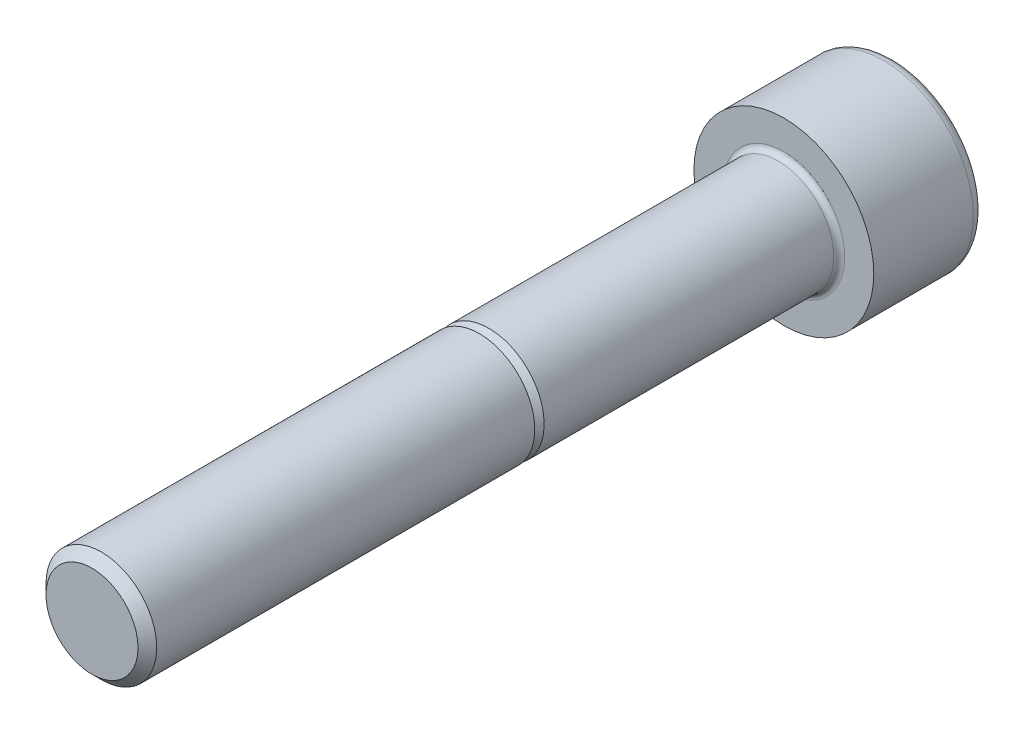
ISO-10303-21;
HEADER;
FILE_DESCRIPTION(('STEP AP214'),'2;1');
FILE_NAME('part.step','',(''),(''),'','','');
FILE_SCHEMA(('AUTOMOTIVE_DESIGN { 1 0 10303 214 1 1 1 1 }'));
ENDSEC;
DATA;
#1=APPLICATION_CONTEXT('core data for automotive mechanical design processes');
#2=APPLICATION_PROTOCOL_DEFINITION('international standard','automotive_design',2000,#1);
#3=PRODUCT_CONTEXT('',#1,'mechanical');
#4=PRODUCT('Part','Part','',(#3));
#5=PRODUCT_RELATED_PRODUCT_CATEGORY('part','',(#4));
#6=PRODUCT_DEFINITION_FORMATION('','',#4);
#7=PRODUCT_DEFINITION_CONTEXT('part definition',#1,'design');
#8=PRODUCT_DEFINITION('design','',#6,#7);
#9=PRODUCT_DEFINITION_SHAPE('','',#8);
#10=(LENGTH_UNIT() NAMED_UNIT(*) SI_UNIT(.MILLI.,.METRE.));
#11=(NAMED_UNIT(*) PLANE_ANGLE_UNIT() SI_UNIT($,.RADIAN.));
#12=(NAMED_UNIT(*) SI_UNIT($,.STERADIAN.) SOLID_ANGLE_UNIT());
#13=UNCERTAINTY_MEASURE_WITH_UNIT(LENGTH_MEASURE(1.E-05),#10,'distance_accuracy_value','');
#14=(GEOMETRIC_REPRESENTATION_CONTEXT(3) GLOBAL_UNCERTAINTY_ASSIGNED_CONTEXT((#13)) GLOBAL_UNIT_ASSIGNED_CONTEXT((#10,
#11,#12)) REPRESENTATION_CONTEXT('',''));
#15=CARTESIAN_POINT('',(0.,0.,0.));
#16=DIRECTION('',(0.,0.,1.));
#17=DIRECTION('',(1.,0.,0.));
#18=AXIS2_PLACEMENT_3D('',#15,#16,#17);
#19=CARTESIAN_POINT('',(0.,0.,-4.));
#20=DIRECTION('',(0.,0.,-1.));
#21=DIRECTION('',(-1.,0.,0.));
#22=AXIS2_PLACEMENT_3D('',#19,#20,#21);
#23=PLANE('',#22);
#24=DIRECTION('',(0.,-1.,0.));
#25=VECTOR('',#24,1.);
#26=CARTESIAN_POINT('',(3.,1.73205080756887,-4.));
#27=LINE('',#26,#25);
#28=CARTESIAN_POINT('',(3.,1.73205080756887,-4.));
#29=VERTEX_POINT('',#28);
#30=CARTESIAN_POINT('',(3.,0.,-4.));
#31=VERTEX_POINT('',#30);
#32=EDGE_CURVE('E298',#29,#31,#27,.T.);
#33=ORIENTED_EDGE('',*,*,#32,.T.);
#34=CARTESIAN_POINT('',(0.,0.,-4.));
#35=DIRECTION('',(0.,0.,1.));
#36=DIRECTION('',(1.,0.,0.));
#37=AXIS2_PLACEMENT_3D('',#34,#35,#36);
#38=CIRCLE('',#37,3.);
#39=CARTESIAN_POINT('',(1.5,2.59807621135332,-4.));
#40=VERTEX_POINT('',#39);
#41=EDGE_CURVE('E60',#31,#40,#38,.T.);
#42=ORIENTED_EDGE('',*,*,#41,.T.);
#43=DIRECTION('',(0.866025403784438,-0.500000000000001,0.));
#44=VECTOR('',#43,1.);
#45=CARTESIAN_POINT('',(0.,3.46410161513775,-4.));
#46=LINE('',#45,#44);
#47=EDGE_CURVE('E295',#40,#29,#46,.T.);
#48=ORIENTED_EDGE('',*,*,#47,.T.);
#49=EDGE_LOOP('',(#33,#42,#48));
#50=FACE_BOUND('',#49,.T.);
#51=ADVANCED_FACE('F45',(#50),#23,.T.);
#52=CARTESIAN_POINT('',(0.,3.46410161513775,-4.));
#53=VERTEX_POINT('',#52);
#54=EDGE_CURVE('E296',#53,#40,#46,.T.);
#55=ORIENTED_EDGE('',*,*,#54,.T.);
#56=CARTESIAN_POINT('',(-1.5,2.59807621135332,-4.));
#57=VERTEX_POINT('',#56);
#58=EDGE_CURVE('E236',#40,#57,#38,.T.);
#59=ORIENTED_EDGE('',*,*,#58,.T.);
#60=DIRECTION('',(0.866025403784439,0.499999999999999,0.));
#61=VECTOR('',#60,1.);
#62=CARTESIAN_POINT('',(-3.,1.73205080756888,-4.));
#63=LINE('',#62,#61);
#64=EDGE_CURVE('E291',#57,#53,#63,.T.);
#65=ORIENTED_EDGE('',*,*,#64,.T.);
#66=EDGE_LOOP('',(#55,#59,#65));
#67=FACE_BOUND('',#66,.T.);
#68=ADVANCED_FACE('F136',(#67),#23,.T.);
#69=CARTESIAN_POINT('',(-3.,1.73205080756888,-4.));
#70=VERTEX_POINT('',#69);
#71=EDGE_CURVE('E292',#70,#57,#63,.T.);
#72=ORIENTED_EDGE('',*,*,#71,.T.);
#73=CARTESIAN_POINT('',(-3.,0.,-4.));
#74=VERTEX_POINT('',#73);
#75=EDGE_CURVE('E278',#57,#74,#38,.T.);
#76=ORIENTED_EDGE('',*,*,#75,.T.);
#77=DIRECTION('',(0.,1.,0.));
#78=VECTOR('',#77,1.);
#79=CARTESIAN_POINT('',(-3.,-1.73205080756887,-4.));
#80=LINE('',#79,#78);
#81=EDGE_CURVE('E287',#74,#70,#80,.T.);
#82=ORIENTED_EDGE('',*,*,#81,.T.);
#83=EDGE_LOOP('',(#72,#76,#82));
#84=FACE_BOUND('',#83,.T.);
#85=ADVANCED_FACE('F142',(#84),#23,.T.);
#86=CARTESIAN_POINT('',(-3.,-1.73205080756887,-4.));
#87=VERTEX_POINT('',#86);
#88=EDGE_CURVE('E288',#87,#74,#80,.T.);
#89=ORIENTED_EDGE('',*,*,#88,.T.);
#90=CARTESIAN_POINT('',(-1.5,-2.59807621135332,-4.));
#91=VERTEX_POINT('',#90);
#92=EDGE_CURVE('E282',#74,#91,#38,.T.);
#93=ORIENTED_EDGE('',*,*,#92,.T.);
#94=DIRECTION('',(-0.866025403784438,0.500000000000001,0.));
#95=VECTOR('',#94,1.);
#96=CARTESIAN_POINT('',(0.,-3.46410161513775,-4.));
#97=LINE('',#96,#95);
#98=EDGE_CURVE('E251',#91,#87,#97,.T.);
#99=ORIENTED_EDGE('',*,*,#98,.T.);
#100=EDGE_LOOP('',(#89,#93,#99));
#101=FACE_BOUND('',#100,.T.);
#102=ADVANCED_FACE('F314',(#101),#23,.T.);
#103=CARTESIAN_POINT('',(0.,-3.46410161513775,-4.));
#104=VERTEX_POINT('',#103);
#105=EDGE_CURVE('E284',#104,#91,#97,.T.);
#106=ORIENTED_EDGE('',*,*,#105,.T.);
#107=CARTESIAN_POINT('',(1.5,-2.59807621135332,-4.));
#108=VERTEX_POINT('',#107);
#109=EDGE_CURVE('E310',#91,#108,#38,.T.);
#110=ORIENTED_EDGE('',*,*,#109,.T.);
#111=DIRECTION('',(-0.866025403784439,-0.499999999999999,0.));
#112=VECTOR('',#111,1.);
#113=CARTESIAN_POINT('',(3.,-1.73205080756888,-4.));
#114=LINE('',#113,#112);
#115=EDGE_CURVE('E299',#108,#104,#114,.T.);
#116=ORIENTED_EDGE('',*,*,#115,.T.);
#117=EDGE_LOOP('',(#106,#110,#116));
#118=FACE_BOUND('',#117,.T.);
#119=ADVANCED_FACE('F134',(#118),#23,.T.);
#120=CARTESIAN_POINT('',(0.,0.,50.));
#121=DIRECTION('',(0.,0.,-1.));
#122=DIRECTION('',(-1.,0.,0.));
#123=AXIS2_PLACEMENT_3D('',#120,#121,#122);
#124=CYLINDRICAL_SURFACE('',#123,4.);
#125=CARTESIAN_POINT('',(0.,0.,49.3234375));
#126=DIRECTION('',(0.,0.,1.));
#127=DIRECTION('',(1.,0.,0.));
#128=AXIS2_PLACEMENT_3D('',#125,#126,#127);
#129=CIRCLE('',#128,4.);
#130=CARTESIAN_POINT('',(-3.99999999999999,0.,49.3234375));
#131=VERTEX_POINT('',#130);
#132=EDGE_CURVE('E217',#131,#131,#129,.F.);
#133=ORIENTED_EDGE('',*,*,#132,.T.);
#134=EDGE_LOOP('',(#133));
#135=FACE_BOUND('',#134,.T.);
#136=CARTESIAN_POINT('',(0.,0.,22.));
#137=DIRECTION('',(0.,0.,-1.));
#138=DIRECTION('',(-1.,0.,0.));
#139=AXIS2_PLACEMENT_3D('',#136,#137,#138);
#140=CIRCLE('',#139,4.);
#141=CARTESIAN_POINT('',(-4.,0.,22.));
#142=VERTEX_POINT('',#141);
#143=EDGE_CURVE('E254',#142,#142,#140,.T.);
#144=ORIENTED_EDGE('',*,*,#143,.F.);
#145=EDGE_LOOP('',(#144));
#146=FACE_BOUND('',#145,.T.);
#147=ADVANCED_FACE('F194',(#135,#146),#124,.T.);
#148=CARTESIAN_POINT('',(4.,0.,50.));
#149=DIRECTION('',(0.,0.,1.));
#150=DIRECTION('',(1.,0.,0.));
#151=AXIS2_PLACEMENT_3D('',#148,#149,#150);
#152=PLANE('',#151);
#153=CARTESIAN_POINT('',(0.,0.,50.));
#154=DIRECTION('',(0.,0.,1.));
#155=DIRECTION('',(1.,0.,0.));
#156=AXIS2_PLACEMENT_3D('',#153,#154,#155);
#157=CIRCLE('',#156,3.3234375);
#158=CARTESIAN_POINT('',(-3.32343749999999,0.,50.));
#159=VERTEX_POINT('',#158);
#160=EDGE_CURVE('E213',#159,#159,#157,.T.);
#161=ORIENTED_EDGE('',*,*,#160,.T.);
#162=EDGE_LOOP('',(#161));
#163=FACE_BOUND('',#162,.T.);
#164=ADVANCED_FACE('F190',(#163),#152,.T.);
#165=CARTESIAN_POINT('',(0.,0.,-8.));
#166=DIRECTION('',(0.,0.,-1.));
#167=DIRECTION('',(-1.,0.,0.));
#168=AXIS2_PLACEMENT_3D('',#165,#166,#167);
#169=PLANE('',#168);
#170=CARTESIAN_POINT('',(0.,0.,-8.));
#171=DIRECTION('',(0.,0.,-1.));
#172=DIRECTION('',(-1.,0.,0.));
#173=AXIS2_PLACEMENT_3D('',#170,#171,#172);
#174=CIRCLE('',#173,5.7);
#175=CARTESIAN_POINT('',(-5.7,0.,-8.));
#176=VERTEX_POINT('',#175);
#177=EDGE_CURVE('E53',#176,#176,#174,.T.);
#178=ORIENTED_EDGE('',*,*,#177,.T.);
#179=EDGE_LOOP('',(#178));
#180=FACE_BOUND('',#179,.T.);
#181=DIRECTION('',(-0.866025403784438,0.500000000000001,0.));
#182=VECTOR('',#181,1.);
#183=CARTESIAN_POINT('',(0.,-3.46410161513775,-8.));
#184=LINE('',#183,#182);
#185=CARTESIAN_POINT('',(0.,-3.46410161513775,-8.));
#186=VERTEX_POINT('',#185);
#187=CARTESIAN_POINT('',(-3.,-1.73205080756887,-8.));
#188=VERTEX_POINT('',#187);
#189=EDGE_CURVE('E68',#186,#188,#184,.T.);
#190=ORIENTED_EDGE('',*,*,#189,.F.);
#191=DIRECTION('',(-0.866025403784439,-0.499999999999999,0.));
#192=VECTOR('',#191,1.);
#193=CARTESIAN_POINT('',(3.,-1.73205080756888,-8.));
#194=LINE('',#193,#192);
#195=CARTESIAN_POINT('',(3.,-1.73205080756888,-8.));
#196=VERTEX_POINT('',#195);
#197=EDGE_CURVE('E228',#196,#186,#194,.T.);
#198=ORIENTED_EDGE('',*,*,#197,.F.);
#199=DIRECTION('',(0.,-1.,0.));
#200=VECTOR('',#199,1.);
#201=CARTESIAN_POINT('',(3.,1.73205080756887,-8.));
#202=LINE('',#201,#200);
#203=CARTESIAN_POINT('',(3.,1.73205080756887,-8.));
#204=VERTEX_POINT('',#203);
#205=EDGE_CURVE('E247',#204,#196,#202,.T.);
#206=ORIENTED_EDGE('',*,*,#205,.F.);
#207=DIRECTION('',(0.866025403784438,-0.500000000000001,0.));
#208=VECTOR('',#207,1.);
#209=CARTESIAN_POINT('',(0.,3.46410161513775,-8.));
#210=LINE('',#209,#208);
#211=CARTESIAN_POINT('',(0.,3.46410161513775,-8.));
#212=VERTEX_POINT('',#211);
#213=EDGE_CURVE('E244',#212,#204,#210,.T.);
#214=ORIENTED_EDGE('',*,*,#213,.F.);
#215=DIRECTION('',(0.866025403784439,0.499999999999999,0.));
#216=VECTOR('',#215,1.);
#217=CARTESIAN_POINT('',(-3.,1.73205080756888,-8.));
#218=LINE('',#217,#216);
#219=CARTESIAN_POINT('',(-3.,1.73205080756888,-8.));
#220=VERTEX_POINT('',#219);
#221=EDGE_CURVE('E233',#220,#212,#218,.T.);
#222=ORIENTED_EDGE('',*,*,#221,.F.);
#223=DIRECTION('',(0.,1.,0.));
#224=VECTOR('',#223,1.);
#225=CARTESIAN_POINT('',(-3.,-1.73205080756887,-8.));
#226=LINE('',#225,#224);
#227=EDGE_CURVE('E231',#188,#220,#226,.T.);
#228=ORIENTED_EDGE('',*,*,#227,.F.);
#229=EDGE_LOOP('',(#190,#198,#206,#214,#222,#228));
#230=FACE_BOUND('',#229,.T.);
#231=ADVANCED_FACE('F186',(#180,#230),#169,.T.);
#232=CARTESIAN_POINT('',(0.,0.,50.));
#233=DIRECTION('',(0.,0.,-1.));
#234=DIRECTION('',(-1.,0.,0.));
#235=AXIS2_PLACEMENT_3D('',#232,#233,#234);
#236=CYLINDRICAL_SURFACE('',#235,6.5);
#237=CARTESIAN_POINT('',(0.,0.,-7.2));
#238=DIRECTION('',(0.,0.,-1.));
#239=DIRECTION('',(-1.,0.,0.));
#240=AXIS2_PLACEMENT_3D('',#237,#238,#239);
#241=CIRCLE('',#240,6.5);
#242=CARTESIAN_POINT('',(-6.5,0.,-7.2));
#243=VERTEX_POINT('',#242);
#244=EDGE_CURVE('E11',#243,#243,#241,.F.);
#245=ORIENTED_EDGE('',*,*,#244,.T.);
#246=EDGE_LOOP('',(#245));
#247=FACE_BOUND('',#246,.T.);
#248=CARTESIAN_POINT('',(0.,0.,0.));
#249=DIRECTION('',(0.,0.,-1.));
#250=DIRECTION('',(-1.,0.,0.));
#251=AXIS2_PLACEMENT_3D('',#248,#249,#250);
#252=CIRCLE('',#251,6.5);
#253=CARTESIAN_POINT('',(-6.5,0.,0.));
#254=VERTEX_POINT('',#253);
#255=EDGE_CURVE('E273',#254,#254,#252,.T.);
#256=ORIENTED_EDGE('',*,*,#255,.T.);
#257=EDGE_LOOP('',(#256));
#258=FACE_BOUND('',#257,.T.);
#259=ADVANCED_FACE('F182',(#247,#258),#236,.T.);
#260=CARTESIAN_POINT('',(6.5,0.,0.));
#261=DIRECTION('',(0.,0.,1.));
#262=DIRECTION('',(1.,0.,0.));
#263=AXIS2_PLACEMENT_3D('',#260,#261,#262);
#264=PLANE('',#263);
#265=CARTESIAN_POINT('',(0.,0.,0.));
#266=DIRECTION('',(0.,0.,1.));
#267=DIRECTION('',(1.,0.,0.));
#268=AXIS2_PLACEMENT_3D('',#265,#266,#267);
#269=CIRCLE('',#268,4.4);
#270=CARTESIAN_POINT('',(4.4,0.,0.));
#271=VERTEX_POINT('',#270);
#272=EDGE_CURVE('E212',#271,#271,#269,.F.);
#273=ORIENTED_EDGE('',*,*,#272,.T.);
#274=EDGE_LOOP('',(#273));
#275=FACE_BOUND('',#274,.T.);
#276=ORIENTED_EDGE('',*,*,#255,.F.);
#277=EDGE_LOOP('',(#276));
#278=FACE_BOUND('',#277,.T.);
#279=ADVANCED_FACE('F178',(#275,#278),#264,.T.);
#280=CARTESIAN_POINT('',(0.,0.,50.));
#281=DIRECTION('',(0.,0.,-1.));
#282=DIRECTION('',(-1.,0.,0.));
#283=AXIS2_PLACEMENT_3D('',#280,#281,#282);
#284=CYLINDRICAL_SURFACE('',#283,4.);
#285=CARTESIAN_POINT('',(0.,0.,0.399999999999998));
#286=DIRECTION('',(0.,0.,1.));
#287=DIRECTION('',(1.,0.,0.));
#288=AXIS2_PLACEMENT_3D('',#285,#286,#287);
#289=CIRCLE('',#288,4.);
#290=CARTESIAN_POINT('',(4.,0.,0.399999999999997));
#291=VERTEX_POINT('',#290);
#292=EDGE_CURVE('E209',#291,#291,#289,.T.);
#293=ORIENTED_EDGE('',*,*,#292,.T.);
#294=EDGE_LOOP('',(#293));
#295=FACE_BOUND('',#294,.T.);
#296=CARTESIAN_POINT('',(0.,0.,21.3234375));
#297=DIRECTION('',(0.,0.,-1.));
#298=DIRECTION('',(-1.,0.,0.));
#299=AXIS2_PLACEMENT_3D('',#296,#297,#298);
#300=CIRCLE('',#299,4.);
#301=CARTESIAN_POINT('',(-4.,0.,21.3234375));
#302=VERTEX_POINT('',#301);
#303=EDGE_CURVE('E270',#302,#302,#300,.T.);
#304=ORIENTED_EDGE('',*,*,#303,.T.);
#305=EDGE_LOOP('',(#304));
#306=FACE_BOUND('',#305,.T.);
#307=ADVANCED_FACE('F174',(#295,#306),#284,.T.);
#308=CARTESIAN_POINT('',(0.,0.,21.3234375));
#309=DIRECTION('',(0.,0.,-1.));
#310=DIRECTION('',(-1.,0.,0.));
#311=AXIS2_PLACEMENT_3D('',#308,#309,#310);
#312=CONICAL_SURFACE('',#311,4.,0.785398163397451);
#313=CARTESIAN_POINT('',(0.,0.,22.));
#314=DIRECTION('',(0.,0.,-1.));
#315=DIRECTION('',(-1.,0.,0.));
#316=AXIS2_PLACEMENT_3D('',#313,#314,#315);
#317=CIRCLE('',#316,3.3234375);
#318=CARTESIAN_POINT('',(-3.3234375,0.,22.));
#319=VERTEX_POINT('',#318);
#320=EDGE_CURVE('E267',#319,#319,#317,.T.);
#321=ORIENTED_EDGE('',*,*,#320,.T.);
#322=EDGE_LOOP('',(#321));
#323=FACE_BOUND('',#322,.T.);
#324=ORIENTED_EDGE('',*,*,#303,.F.);
#325=EDGE_LOOP('',(#324));
#326=FACE_BOUND('',#325,.T.);
#327=ADVANCED_FACE('F170',(#323,#326),#312,.T.);
#328=CARTESIAN_POINT('',(3.32343750000001,0.,22.));
#329=DIRECTION('',(0.,0.,-1.));
#330=DIRECTION('',(-1.,0.,0.));
#331=AXIS2_PLACEMENT_3D('',#328,#329,#330);
#332=PLANE('',#331);
#333=ORIENTED_EDGE('',*,*,#143,.T.);
#334=EDGE_LOOP('',(#333));
#335=FACE_BOUND('',#334,.T.);
#336=ORIENTED_EDGE('',*,*,#320,.F.);
#337=EDGE_LOOP('',(#336));
#338=FACE_BOUND('',#337,.T.);
#339=ADVANCED_FACE('F168',(#335,#338),#332,.T.);
#340=CARTESIAN_POINT('',(0.,-3.46410161513775,-4.));
#341=DIRECTION('',(-0.500000000000001,-0.866025403784438,0.));
#342=DIRECTION('',(0.866025403784438,-0.500000000000001,0.));
#343=AXIS2_PLACEMENT_3D('',#340,#341,#342);
#344=PLANE('',#343);
#345=ORIENTED_EDGE('',*,*,#189,.T.);
#346=DIRECTION('',(0.,0.,-1.));
#347=VECTOR('',#346,1.);
#348=CARTESIAN_POINT('',(-3.,-1.73205080756887,-4.));
#349=LINE('',#348,#347);
#350=EDGE_CURVE('E263',#87,#188,#349,.T.);
#351=ORIENTED_EDGE('',*,*,#350,.F.);
#352=ORIENTED_EDGE('',*,*,#98,.F.);
#353=ORIENTED_EDGE('',*,*,#105,.F.);
#354=DIRECTION('',(0.,0.,-1.));
#355=VECTOR('',#354,1.);
#356=CARTESIAN_POINT('',(0.,-3.46410161513775,-4.));
#357=LINE('',#356,#355);
#358=EDGE_CURVE('E252',#104,#186,#357,.T.);
#359=ORIENTED_EDGE('',*,*,#358,.T.);
#360=EDGE_LOOP('',(#345,#351,#352,#353,#359));
#361=FACE_BOUND('',#360,.T.);
#362=ADVANCED_FACE('F150',(#361),#344,.F.);
#363=CARTESIAN_POINT('',(3.,-1.73205080756888,-4.));
#364=DIRECTION('',(0.5,-0.866025403784439,0.));
#365=DIRECTION('',(0.866025403784439,0.499999999999999,0.));
#366=AXIS2_PLACEMENT_3D('',#363,#364,#365);
#367=PLANE('',#366);
#368=ORIENTED_EDGE('',*,*,#197,.T.);
#369=ORIENTED_EDGE('',*,*,#358,.F.);
#370=ORIENTED_EDGE('',*,*,#115,.F.);
#371=CARTESIAN_POINT('',(3.,-1.73205080756888,-4.));
#372=VERTEX_POINT('',#371);
#373=EDGE_CURVE('E239',#372,#108,#114,.T.);
#374=ORIENTED_EDGE('',*,*,#373,.F.);
#375=DIRECTION('',(0.,0.,-1.));
#376=VECTOR('',#375,1.);
#377=CARTESIAN_POINT('',(3.,-1.73205080756888,-4.));
#378=LINE('',#377,#376);
#379=EDGE_CURVE('E255',#372,#196,#378,.T.);
#380=ORIENTED_EDGE('',*,*,#379,.T.);
#381=EDGE_LOOP('',(#368,#369,#370,#374,#380));
#382=FACE_BOUND('',#381,.T.);
#383=ADVANCED_FACE('F146',(#382),#367,.F.);
#384=CARTESIAN_POINT('',(3.,1.73205080756887,-4.));
#385=DIRECTION('',(1.,0.,0.));
#386=DIRECTION('',(0.,0.,-1.));
#387=AXIS2_PLACEMENT_3D('',#384,#385,#386);
#388=PLANE('',#387);
#389=ORIENTED_EDGE('',*,*,#205,.T.);
#390=ORIENTED_EDGE('',*,*,#379,.F.);
#391=EDGE_CURVE('E297',#31,#372,#27,.T.);
#392=ORIENTED_EDGE('',*,*,#391,.F.);
#393=ORIENTED_EDGE('',*,*,#32,.F.);
#394=DIRECTION('',(0.,0.,-1.));
#395=VECTOR('',#394,1.);
#396=CARTESIAN_POINT('',(3.,1.73205080756887,-4.));
#397=LINE('',#396,#395);
#398=EDGE_CURVE('E257',#29,#204,#397,.T.);
#399=ORIENTED_EDGE('',*,*,#398,.T.);
#400=EDGE_LOOP('',(#389,#390,#392,#393,#399));
#401=FACE_BOUND('',#400,.T.);
#402=ADVANCED_FACE('F149',(#401),#388,.F.);
#403=CARTESIAN_POINT('',(0.,3.46410161513775,-4.));
#404=DIRECTION('',(0.500000000000001,0.866025403784438,0.));
#405=DIRECTION('',(-0.866025403784438,0.500000000000001,0.));
#406=AXIS2_PLACEMENT_3D('',#403,#404,#405);
#407=PLANE('',#406);
#408=ORIENTED_EDGE('',*,*,#213,.T.);
#409=ORIENTED_EDGE('',*,*,#398,.F.);
#410=ORIENTED_EDGE('',*,*,#47,.F.);
#411=ORIENTED_EDGE('',*,*,#54,.F.);
#412=DIRECTION('',(0.,0.,-1.));
#413=VECTOR('',#412,1.);
#414=CARTESIAN_POINT('',(0.,3.46410161513775,-4.));
#415=LINE('',#414,#413);
#416=EDGE_CURVE('E259',#53,#212,#415,.T.);
#417=ORIENTED_EDGE('',*,*,#416,.T.);
#418=EDGE_LOOP('',(#408,#409,#410,#411,#417));
#419=FACE_BOUND('',#418,.T.);
#420=ADVANCED_FACE('F154',(#419),#407,.F.);
#421=CARTESIAN_POINT('',(-3.,1.73205080756888,-4.));
#422=DIRECTION('',(-0.499999999999999,0.866025403784439,0.));
#423=DIRECTION('',(-0.866025403784439,-0.499999999999999,0.));
#424=AXIS2_PLACEMENT_3D('',#421,#422,#423);
#425=PLANE('',#424);
#426=ORIENTED_EDGE('',*,*,#221,.T.);
#427=ORIENTED_EDGE('',*,*,#416,.F.);
#428=ORIENTED_EDGE('',*,*,#64,.F.);
#429=ORIENTED_EDGE('',*,*,#71,.F.);
#430=DIRECTION('',(0.,0.,-1.));
#431=VECTOR('',#430,1.);
#432=CARTESIAN_POINT('',(-3.,1.73205080756888,-4.));
#433=LINE('',#432,#431);
#434=EDGE_CURVE('E261',#70,#220,#433,.T.);
#435=ORIENTED_EDGE('',*,*,#434,.T.);
#436=EDGE_LOOP('',(#426,#427,#428,#429,#435));
#437=FACE_BOUND('',#436,.T.);
#438=ADVANCED_FACE('F158',(#437),#425,.F.);
#439=CARTESIAN_POINT('',(-3.,-1.73205080756887,-4.));
#440=DIRECTION('',(-1.,0.,0.));
#441=DIRECTION('',(0.,0.,1.));
#442=AXIS2_PLACEMENT_3D('',#439,#440,#441);
#443=PLANE('',#442);
#444=ORIENTED_EDGE('',*,*,#227,.T.);
#445=ORIENTED_EDGE('',*,*,#434,.F.);
#446=ORIENTED_EDGE('',*,*,#81,.F.);
#447=ORIENTED_EDGE('',*,*,#88,.F.);
#448=ORIENTED_EDGE('',*,*,#350,.T.);
#449=EDGE_LOOP('',(#444,#445,#446,#447,#448));
#450=FACE_BOUND('',#449,.T.);
#451=ADVANCED_FACE('F131',(#450),#443,.F.);
#452=ORIENTED_EDGE('',*,*,#373,.T.);
#453=EDGE_CURVE('E237',#108,#31,#38,.T.);
#454=ORIENTED_EDGE('',*,*,#453,.T.);
#455=ORIENTED_EDGE('',*,*,#391,.T.);
#456=EDGE_LOOP('',(#452,#454,#455));
#457=FACE_BOUND('',#456,.T.);
#458=ADVANCED_FACE('F121',(#457),#23,.T.);
#459=CARTESIAN_POINT('',(0.,0.,-2.26794919243112));
#460=DIRECTION('',(0.,0.,-1.));
#461=DIRECTION('',(-1.,0.,0.));
#462=AXIS2_PLACEMENT_3D('',#459,#460,#461);
#463=CONICAL_SURFACE('',#462,0.,1.0471975511966);
#464=ORIENTED_EDGE('',*,*,#41,.F.);
#465=ORIENTED_EDGE('',*,*,#453,.F.);
#466=ORIENTED_EDGE('',*,*,#109,.F.);
#467=ORIENTED_EDGE('',*,*,#92,.F.);
#468=ORIENTED_EDGE('',*,*,#75,.F.);
#469=ORIENTED_EDGE('',*,*,#58,.F.);
#470=EDGE_LOOP('',(#464,#465,#466,#467,#468,#469));
#471=FACE_BOUND('',#470,.T.);
#472=CARTESIAN_POINT('',(0.,0.,-2.26794919243112));
#473=VERTEX_POINT('',#472);
#474=VERTEX_LOOP('',#473);
#475=FACE_BOUND('',#474,.T.);
#476=ADVANCED_FACE('F118',(#471,#475),#463,.F.);
#477=CARTESIAN_POINT('',(0.,0.,49.3234375));
#478=DIRECTION('',(0.,0.,-1.));
#479=DIRECTION('',(-1.,0.,0.));
#480=AXIS2_PLACEMENT_3D('',#477,#478,#479);
#481=CONICAL_SURFACE('',#480,4.,0.785398163397446);
#482=CARTESIAN_POINT('',(-3.32343749999999,0.,50.));
#483=CARTESIAN_POINT('',(-3.33048502604166,0.,49.9929524739583));
#484=CARTESIAN_POINT('',(-3.33753255208333,0.,49.9859049479167));
#485=CARTESIAN_POINT('',(-3.35162760416666,0.,49.9718098958333));
#486=CARTESIAN_POINT('',(-3.35867513020832,0.,49.9647623697917));
#487=CARTESIAN_POINT('',(-3.37277018229166,0.,49.9506673177083));
#488=CARTESIAN_POINT('',(-3.37981770833332,0.,49.9436197916667));
#489=CARTESIAN_POINT('',(-3.39391276041666,0.,49.9295247395833));
#490=CARTESIAN_POINT('',(-3.40096028645832,0.,49.9224772135417));
#491=CARTESIAN_POINT('',(-3.41505533854166,0.,49.9083821614583));
#492=CARTESIAN_POINT('',(-3.42210286458332,0.,49.9013346354167));
#493=CARTESIAN_POINT('',(-3.43619791666666,0.,49.8872395833333));
#494=CARTESIAN_POINT('',(-3.44324544270833,0.,49.8801920572917));
#495=CARTESIAN_POINT('',(-3.45734049479166,0.,49.8660970052083));
#496=CARTESIAN_POINT('',(-3.46438802083332,0.,49.8590494791667));
#497=CARTESIAN_POINT('',(-3.47848307291666,0.,49.8449544270833));
#498=CARTESIAN_POINT('',(-3.48553059895833,0.,49.8379069010417));
#499=CARTESIAN_POINT('',(-3.49962565104166,0.,49.8238118489583));
#500=CARTESIAN_POINT('',(-3.50667317708333,0.,49.8167643229167));
#501=CARTESIAN_POINT('',(-3.52076822916666,0.,49.8026692708333));
#502=CARTESIAN_POINT('',(-3.52781575520832,0.,49.7956217447917));
#503=CARTESIAN_POINT('',(-3.54191080729166,0.,49.7815266927083));
#504=CARTESIAN_POINT('',(-3.54895833333332,0.,49.7744791666667));
#505=CARTESIAN_POINT('',(-3.56305338541666,0.,49.7603841145833));
#506=CARTESIAN_POINT('',(-3.57010091145833,0.,49.7533365885417));
#507=CARTESIAN_POINT('',(-3.58419596354166,0.,49.7392415364583));
#508=CARTESIAN_POINT('',(-3.59124348958333,0.,49.7321940104167));
#509=CARTESIAN_POINT('',(-3.60533854166666,0.,49.7180989583333));
#510=CARTESIAN_POINT('',(-3.61238606770833,0.,49.7110514322917));
#511=CARTESIAN_POINT('',(-3.62648111979166,0.,49.6969563802083));
#512=CARTESIAN_POINT('',(-3.63352864583332,0.,49.6899088541667));
#513=CARTESIAN_POINT('',(-3.64762369791666,0.,49.6758138020833));
#514=CARTESIAN_POINT('',(-3.65467122395833,0.,49.6687662760417));
#515=CARTESIAN_POINT('',(-3.66876627604166,0.,49.6546712239583));
#516=CARTESIAN_POINT('',(-3.67581380208333,0.,49.6476236979167));
#517=CARTESIAN_POINT('',(-3.68990885416666,0.,49.6335286458333));
#518=CARTESIAN_POINT('',(-3.69695638020833,0.,49.6264811197917));
#519=CARTESIAN_POINT('',(-3.71105143229166,0.,49.6123860677083));
#520=CARTESIAN_POINT('',(-3.71809895833333,0.,49.6053385416667));
#521=CARTESIAN_POINT('',(-3.73219401041666,0.,49.5912434895833));
#522=CARTESIAN_POINT('',(-3.73924153645833,0.,49.5841959635417));
#523=CARTESIAN_POINT('',(-3.75333658854166,0.,49.5701009114583));
#524=CARTESIAN_POINT('',(-3.76038411458333,0.,49.5630533854167));
#525=CARTESIAN_POINT('',(-3.77447916666666,0.,49.5489583333333));
#526=CARTESIAN_POINT('',(-3.78152669270833,0.,49.5419108072917));
#527=CARTESIAN_POINT('',(-3.79562174479166,0.,49.5278157552083));
#528=CARTESIAN_POINT('',(-3.80266927083333,0.,49.5207682291667));
#529=CARTESIAN_POINT('',(-3.81676432291666,0.,49.5066731770833));
#530=CARTESIAN_POINT('',(-3.82381184895833,0.,49.4996256510417));
#531=CARTESIAN_POINT('',(-3.83790690104166,0.,49.4855305989583));
#532=CARTESIAN_POINT('',(-3.84495442708333,0.,49.4784830729167));
#533=CARTESIAN_POINT('',(-3.85904947916666,0.,49.4643880208333));
#534=CARTESIAN_POINT('',(-3.86609700520833,0.,49.4573404947917));
#535=CARTESIAN_POINT('',(-3.88019205729166,0.,49.4432454427083));
#536=CARTESIAN_POINT('',(-3.88723958333333,0.,49.4361979166667));
#537=CARTESIAN_POINT('',(-3.90133463541666,0.,49.4221028645833));
#538=CARTESIAN_POINT('',(-3.90838216145833,0.,49.4150553385417));
#539=CARTESIAN_POINT('',(-3.92247721354166,0.,49.4009602864583));
#540=CARTESIAN_POINT('',(-3.92952473958333,0.,49.3939127604167));
#541=CARTESIAN_POINT('',(-3.94361979166666,0.,49.3798177083333));
#542=CARTESIAN_POINT('',(-3.95066731770833,0.,49.3727701822917));
#543=CARTESIAN_POINT('',(-3.96476236979166,0.,49.3586751302083));
#544=CARTESIAN_POINT('',(-3.97180989583333,0.,49.3516276041667));
#545=CARTESIAN_POINT('',(-3.98590494791666,0.,49.3375325520833));
#546=CARTESIAN_POINT('',(-3.99295247395833,0.,49.3304850260417));
#547=CARTESIAN_POINT('',(-3.99999999999999,0.,49.3234375));
#548=B_SPLINE_CURVE_WITH_KNOTS('',3,(#482,#483,#484,#485,#486,#487,#488,#489,#490,#491,#492,
#493,#494,#495,#496,#497,#498,#499,#500,#501,#502,#503,#504,#505,#506,#507,#508,#509,#510,#511,
#512,#513,#514,#515,#516,#517,#518,#519,#520,#521,#522,#523,#524,#525,#526,#527,#528,#529,#530,
#531,#532,#533,#534,#535,#536,#537,#538,#539,#540,#541,#542,#543,#544,#545,#546,#547),
.UNSPECIFIED.,.F.,.F.,(4,2,2,2,2,2,2,2,2,2,2,2,2,2,2,2,2,2,2,2,2,2,2,2,2,2,2,2,2,2,2,2,4),(0.,
0.0299001207279086,0.0598002414558168,0.0897003621837254,0.119600482911634,0.149500603639542,
0.179400724367451,0.209300845095359,0.239200965823263,0.269101086551172,0.29900120727908,
0.328901328006988,0.358801448734897,0.388701569462806,0.418601690190714,0.448501810918623,
0.478401931646526,0.508302052374435,0.538202173102343,0.568102293830252,0.59800241455816,
0.627902535286069,0.657802656013977,0.687702776741886,0.717602897469794,0.747503018197698,
0.777403138925607,0.807303259653515,0.837203380381424,0.867103501109332,0.89700362183724,
0.926903742565149,0.956803863293057),.UNSPECIFIED.);
#549=EDGE_CURVE('BSEAM120',#159,#131,#548,.T.);
#550=ORIENTED_EDGE('',*,*,#160,.F.);
#551=ORIENTED_EDGE('',*,*,#132,.F.);
#552=ORIENTED_EDGE('',*,*,#549,.T.);
#553=ORIENTED_EDGE('',*,*,#549,.F.);
#554=EDGE_LOOP('',(#550,#552,#551,#553));
#555=FACE_BOUND('',#554,.T.);
#556=ADVANCED_FACE('F120',(#555),#481,.T.);
#557=CARTESIAN_POINT('',(0.,0.,0.399999999999998));
#558=DIRECTION('',(0.,0.,1.));
#559=DIRECTION('',(1.,0.,0.));
#560=AXIS2_PLACEMENT_3D('',#557,#558,#559);
#561=TOROIDAL_SURFACE('',#560,4.4,0.4);
#562=ORIENTED_EDGE('',*,*,#292,.F.);
#563=EDGE_LOOP('',(#562));
#564=FACE_BOUND('',#563,.T.);
#565=ORIENTED_EDGE('',*,*,#272,.F.);
#566=EDGE_LOOP('',(#565));
#567=FACE_BOUND('',#566,.T.);
#568=ADVANCED_FACE('F128',(#564,#567),#561,.F.);
#569=CARTESIAN_POINT('',(0.,0.,-7.2));
#570=DIRECTION('',(0.,0.,-1.));
#571=DIRECTION('',(-1.,0.,0.));
#572=AXIS2_PLACEMENT_3D('',#569,#570,#571);
#573=TOROIDAL_SURFACE('',#572,5.7,0.8);
#574=ORIENTED_EDGE('',*,*,#244,.F.);
#575=EDGE_LOOP('',(#574));
#576=FACE_BOUND('',#575,.T.);
#577=ORIENTED_EDGE('',*,*,#177,.F.);
#578=EDGE_LOOP('',(#577));
#579=FACE_BOUND('',#578,.T.);
#580=ADVANCED_FACE('F47',(#576,#579),#573,.T.);
#581=CLOSED_SHELL('',(#51,#68,#85,#102,#119,#147,#164,#231,#259,#279,#307,#327,#339,#362,#383,
#402,#420,#438,#451,#458,#476,#556,#568,#580));
#582=MANIFOLD_SOLID_BREP('B2',#581);
#583=ADVANCED_BREP_SHAPE_REPRESENTATION('',(#18,#582),#14);
#584=SHAPE_DEFINITION_REPRESENTATION(#9,#583);
ENDSEC;
END-ISO-10303-21;
